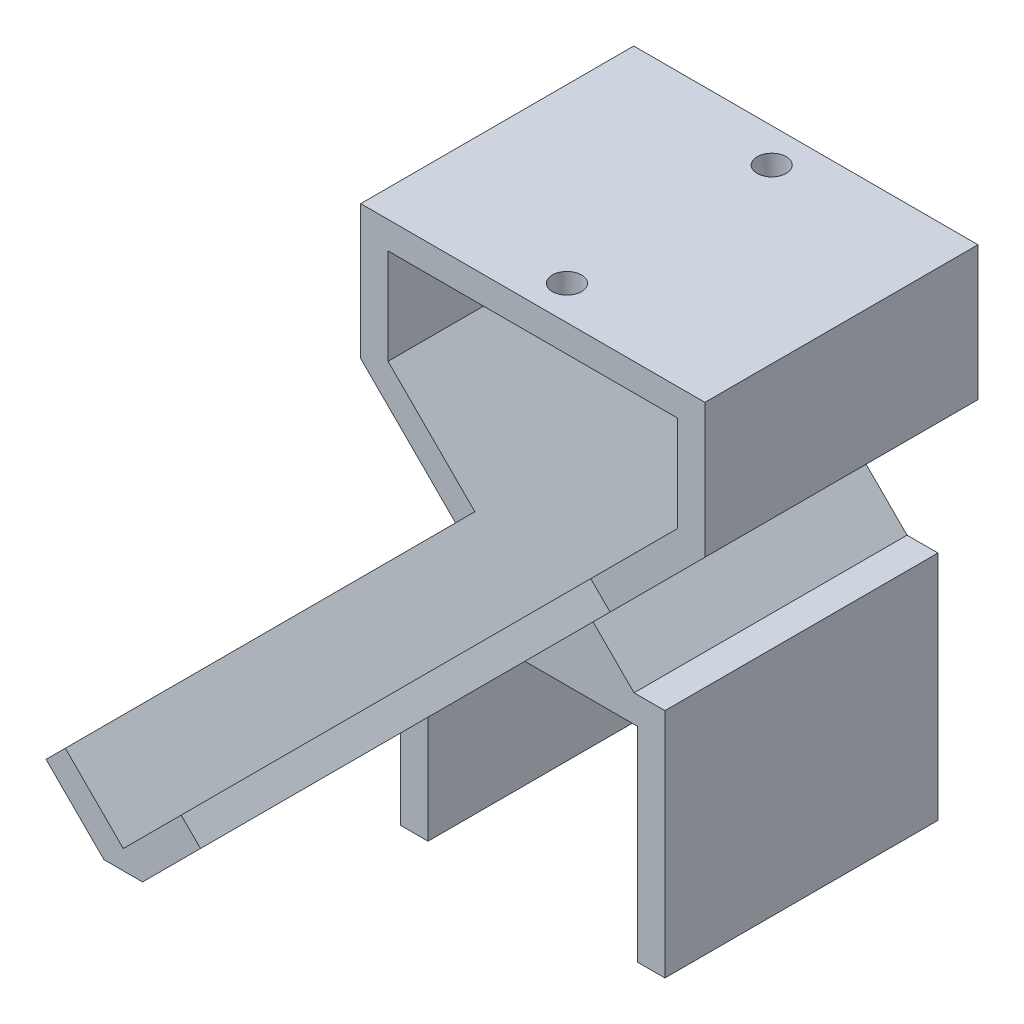
ISO-10303-21;
HEADER;
FILE_DESCRIPTION(('STEP AP214'),'2;1');
FILE_NAME('part.step','',(''),(''),'','','');
FILE_SCHEMA(('AUTOMOTIVE_DESIGN { 1 0 10303 214 1 1 1 1 }'));
ENDSEC;
DATA;
#1=APPLICATION_CONTEXT('core data for automotive mechanical design processes');
#2=APPLICATION_PROTOCOL_DEFINITION('international standard','automotive_design',2000,#1);
#3=PRODUCT_CONTEXT('',#1,'mechanical');
#4=PRODUCT('Part','Part','',(#3));
#5=PRODUCT_RELATED_PRODUCT_CATEGORY('part','',(#4));
#6=PRODUCT_DEFINITION_FORMATION('','',#4);
#7=PRODUCT_DEFINITION_CONTEXT('part definition',#1,'design');
#8=PRODUCT_DEFINITION('design','',#6,#7);
#9=PRODUCT_DEFINITION_SHAPE('','',#8);
#10=(LENGTH_UNIT() NAMED_UNIT(*) SI_UNIT(.MILLI.,.METRE.));
#11=(NAMED_UNIT(*) PLANE_ANGLE_UNIT() SI_UNIT($,.RADIAN.));
#12=(NAMED_UNIT(*) SI_UNIT($,.STERADIAN.) SOLID_ANGLE_UNIT());
#13=UNCERTAINTY_MEASURE_WITH_UNIT(LENGTH_MEASURE(1.E-05),#10,'distance_accuracy_value','');
#14=(GEOMETRIC_REPRESENTATION_CONTEXT(3) GLOBAL_UNCERTAINTY_ASSIGNED_CONTEXT((#13)) GLOBAL_UNIT_ASSIGNED_CONTEXT((#10,
#11,#12)) REPRESENTATION_CONTEXT('',''));
#15=CARTESIAN_POINT('',(0.,0.,0.));
#16=DIRECTION('',(0.,0.,1.));
#17=DIRECTION('',(1.,0.,0.));
#18=AXIS2_PLACEMENT_3D('',#15,#16,#17);
#19=CARTESIAN_POINT('',(1.79605122421383,-1.79605122421383,25.4));
#20=DIRECTION('',(0.,1.,0.));
#21=DIRECTION('',(0.,0.,-1.));
#22=AXIS2_PLACEMENT_3D('',#19,#20,#21);
#23=PLANE('',#22);
#24=DIRECTION('',(0.,0.,1.));
#25=VECTOR('',#24,1.);
#26=CARTESIAN_POINT('',(-1.79605122421384,-1.79605122421382,25.4));
#27=LINE('',#26,#25);
#28=CARTESIAN_POINT('',(-1.79605122421384,-1.79605122421382,25.4));
#29=VERTEX_POINT('',#28);
#30=CARTESIAN_POINT('',(-1.79605122421384,-1.79605122421382,63.5));
#31=VERTEX_POINT('',#30);
#32=EDGE_CURVE('E336',#29,#31,#27,.T.);
#33=ORIENTED_EDGE('',*,*,#32,.F.);
#34=DIRECTION('',(1.,0.,0.));
#35=VECTOR('',#34,1.);
#36=CARTESIAN_POINT('',(-1.79605122421384,-1.79605122421382,25.4));
#37=LINE('',#36,#35);
#38=CARTESIAN_POINT('',(1.79605122421383,-1.79605122421383,25.4));
#39=VERTEX_POINT('',#38);
#40=EDGE_CURVE('E226',#29,#39,#37,.T.);
#41=ORIENTED_EDGE('',*,*,#40,.T.);
#42=DIRECTION('',(0.,0.,-1.));
#43=VECTOR('',#42,1.);
#44=CARTESIAN_POINT('',(1.79605122421383,-1.79605122421383,25.4));
#45=LINE('',#44,#43);
#46=CARTESIAN_POINT('',(1.79605122421383,-1.79605122421383,63.5));
#47=VERTEX_POINT('',#46);
#48=EDGE_CURVE('E334',#47,#39,#45,.T.);
#49=ORIENTED_EDGE('',*,*,#48,.F.);
#50=DIRECTION('',(-1.,0.,0.));
#51=VECTOR('',#50,1.);
#52=CARTESIAN_POINT('',(0.,-1.79605122421383,63.5));
#53=LINE('',#52,#51);
#54=EDGE_CURVE('E339',#31,#47,#53,.F.);
#55=ORIENTED_EDGE('',*,*,#54,.F.);
#56=EDGE_LOOP('',(#33,#41,#49,#55));
#57=FACE_BOUND('',#56,.T.);
#58=ADVANCED_FACE('F35',(#57),#23,.F.);
#59=CARTESIAN_POINT('',(0.,0.,25.4));
#60=DIRECTION('',(0.,0.,-1.));
#61=DIRECTION('',(-1.,0.,0.));
#62=AXIS2_PLACEMENT_3D('',#59,#60,#61);
#63=PLANE('',#62);
#64=DIRECTION('',(-0.707106781186548,-0.707106781186548,0.));
#65=VECTOR('',#64,1.);
#66=CARTESIAN_POINT('',(-7.18420489685532,3.59210244842766,25.4));
#67=LINE('',#66,#65);
#68=CARTESIAN_POINT('',(-5.38815367264149,5.38815367264149,25.4));
#69=VERTEX_POINT('',#68);
#70=CARTESIAN_POINT('',(-7.18420489685532,3.59210244842766,25.4));
#71=VERTEX_POINT('',#70);
#72=EDGE_CURVE('E287',#69,#71,#67,.T.);
#73=ORIENTED_EDGE('',*,*,#72,.F.);
#74=DIRECTION('',(0.707106781186547,-0.707106781186547,0.));
#75=VECTOR('',#74,1.);
#76=CARTESIAN_POINT('',(0.,0.,25.4));
#77=LINE('',#76,#75);
#78=CARTESIAN_POINT('',(-13.4703841816037,13.4703841816037,25.4));
#79=VERTEX_POINT('',#78);
#80=EDGE_CURVE('E307',#79,#69,#77,.T.);
#81=ORIENTED_EDGE('',*,*,#80,.F.);
#82=DIRECTION('',(0.,-1.,0.));
#83=VECTOR('',#82,1.);
#84=CARTESIAN_POINT('',(-13.4703841816037,13.4703841816037,25.4));
#85=LINE('',#84,#83);
#86=CARTESIAN_POINT('',(-13.4703841816037,22.3603841816037,25.4));
#87=VERTEX_POINT('',#86);
#88=EDGE_CURVE('E560',#87,#79,#85,.T.);
#89=ORIENTED_EDGE('',*,*,#88,.F.);
#90=DIRECTION('',(-1.,0.,0.));
#91=VECTOR('',#90,1.);
#92=CARTESIAN_POINT('',(-13.4703841816037,22.3603841816037,25.4));
#93=LINE('',#92,#91);
#94=CARTESIAN_POINT('',(13.4703841816037,22.3603841816037,25.4));
#95=VERTEX_POINT('',#94);
#96=EDGE_CURVE('E563',#95,#87,#93,.T.);
#97=ORIENTED_EDGE('',*,*,#96,.F.);
#98=DIRECTION('',(0.,1.,0.));
#99=VECTOR('',#98,1.);
#100=CARTESIAN_POINT('',(13.4703841816037,22.3603841816037,25.4));
#101=LINE('',#100,#99);
#102=CARTESIAN_POINT('',(13.4703841816037,13.4703841816037,25.4));
#103=VERTEX_POINT('',#102);
#104=EDGE_CURVE('E566',#103,#95,#101,.T.);
#105=ORIENTED_EDGE('',*,*,#104,.F.);
#106=DIRECTION('',(0.707106781186547,0.707106781186547,0.));
#107=VECTOR('',#106,1.);
#108=CARTESIAN_POINT('',(13.4703841816037,13.4703841816037,25.4));
#109=LINE('',#108,#107);
#110=CARTESIAN_POINT('',(5.38815367264149,5.38815367264149,25.4));
#111=VERTEX_POINT('',#110);
#112=EDGE_CURVE('E543',#111,#103,#109,.T.);
#113=ORIENTED_EDGE('',*,*,#112,.F.);
#114=DIRECTION('',(-0.707106781186548,0.707106781186548,0.));
#115=VECTOR('',#114,1.);
#116=CARTESIAN_POINT('',(7.18420489685532,3.59210244842766,25.4));
#117=LINE('',#116,#115);
#118=CARTESIAN_POINT('',(7.18420489685532,3.59210244842766,25.4));
#119=VERTEX_POINT('',#118);
#120=EDGE_CURVE('E282',#119,#111,#117,.T.);
#121=ORIENTED_EDGE('',*,*,#120,.F.);
#122=DIRECTION('',(0.707106781186547,0.707106781186548,0.));
#123=VECTOR('',#122,1.);
#124=CARTESIAN_POINT('',(16.0103841816037,12.4182817331761,25.4));
#125=LINE('',#124,#123);
#126=CARTESIAN_POINT('',(16.0103841816037,12.4182817331761,25.4));
#127=VERTEX_POINT('',#126);
#128=EDGE_CURVE('E344',#119,#127,#125,.T.);
#129=ORIENTED_EDGE('',*,*,#128,.T.);
#130=DIRECTION('',(0.,1.,0.));
#131=VECTOR('',#130,1.);
#132=CARTESIAN_POINT('',(16.0103841816037,24.9003841816037,25.4));
#133=LINE('',#132,#131);
#134=CARTESIAN_POINT('',(16.0103841816037,24.9003841816037,25.4));
#135=VERTEX_POINT('',#134);
#136=EDGE_CURVE('E396',#127,#135,#133,.T.);
#137=ORIENTED_EDGE('',*,*,#136,.T.);
#138=DIRECTION('',(-1.,0.,0.));
#139=VECTOR('',#138,1.);
#140=CARTESIAN_POINT('',(-16.0103841816037,24.9003841816037,25.4));
#141=LINE('',#140,#139);
#142=CARTESIAN_POINT('',(-16.0103841816037,24.9003841816037,25.4));
#143=VERTEX_POINT('',#142);
#144=EDGE_CURVE('E404',#135,#143,#141,.T.);
#145=ORIENTED_EDGE('',*,*,#144,.T.);
#146=DIRECTION('',(0.,-1.,0.));
#147=VECTOR('',#146,1.);
#148=CARTESIAN_POINT('',(-16.0103841816037,12.4182817331761,25.4));
#149=LINE('',#148,#147);
#150=CARTESIAN_POINT('',(-16.0103841816037,12.4182817331761,25.4));
#151=VERTEX_POINT('',#150);
#152=EDGE_CURVE('E406',#143,#151,#149,.T.);
#153=ORIENTED_EDGE('',*,*,#152,.T.);
#154=DIRECTION('',(0.707106781186548,-0.707106781186547,0.));
#155=VECTOR('',#154,1.);
#156=CARTESIAN_POINT('',(0.,-3.59210244842766,25.4));
#157=LINE('',#156,#155);
#158=EDGE_CURVE('E397',#151,#71,#157,.T.);
#159=ORIENTED_EDGE('',*,*,#158,.T.);
#160=EDGE_LOOP('',(#73,#81,#89,#97,#105,#113,#121,#129,#137,#145,#153,#159));
#161=FACE_BOUND('',#160,.T.);
#162=ADVANCED_FACE('F441',(#161),#63,.F.);
#163=CARTESIAN_POINT('',(0.,0.,0.));
#164=DIRECTION('',(0.,0.,-1.));
#165=DIRECTION('',(-1.,0.,0.));
#166=AXIS2_PLACEMENT_3D('',#163,#164,#165);
#167=PLANE('',#166);
#168=DIRECTION('',(0.707106781186547,0.707106781186548,0.));
#169=VECTOR('',#168,1.);
#170=CARTESIAN_POINT('',(16.0103841816037,12.4182817331761,0.));
#171=LINE('',#170,#169);
#172=CARTESIAN_POINT('',(5.60605122421381,2.01394877578615,0.));
#173=VERTEX_POINT('',#172);
#174=CARTESIAN_POINT('',(16.0103841816037,12.4182817331761,0.));
#175=VERTEX_POINT('',#174);
#176=EDGE_CURVE('E350',#173,#175,#171,.T.);
#177=ORIENTED_EDGE('',*,*,#176,.F.);
#178=DIRECTION('',(0.707106781186552,-0.707106781186543,0.));
#179=VECTOR('',#178,1.);
#180=CARTESIAN_POINT('',(5.60605122421381,2.01394877578615,0.));
#181=LINE('',#180,#179);
#182=CARTESIAN_POINT('',(9.41605122421384,-1.79605122421383,0.));
#183=VERTEX_POINT('',#182);
#184=EDGE_CURVE('E367',#173,#183,#181,.T.);
#185=ORIENTED_EDGE('',*,*,#184,.T.);
#186=DIRECTION('',(1.,0.,0.));
#187=VECTOR('',#186,1.);
#188=CARTESIAN_POINT('',(1.79605122421383,-1.79605122421383,0.));
#189=LINE('',#188,#187);
#190=CARTESIAN_POINT('',(12.29,-1.79605122421383,0.));
#191=VERTEX_POINT('',#190);
#192=EDGE_CURVE('E263',#183,#191,#189,.T.);
#193=ORIENTED_EDGE('',*,*,#192,.T.);
#194=DIRECTION('',(0.,-1.,0.));
#195=VECTOR('',#194,1.);
#196=CARTESIAN_POINT('',(12.29,-1.79605122421383,0.));
#197=LINE('',#196,#195);
#198=CARTESIAN_POINT('',(12.29,-23.3360512242138,0.));
#199=VERTEX_POINT('',#198);
#200=EDGE_CURVE('E232',#191,#199,#197,.T.);
#201=ORIENTED_EDGE('',*,*,#200,.T.);
#202=DIRECTION('',(-1.,0.,0.));
#203=VECTOR('',#202,1.);
#204=CARTESIAN_POINT('',(12.29,-23.3360512242138,0.));
#205=LINE('',#204,#203);
#206=CARTESIAN_POINT('',(9.75,-23.3360512242138,0.));
#207=VERTEX_POINT('',#206);
#208=EDGE_CURVE('E830',#199,#207,#205,.T.);
#209=ORIENTED_EDGE('',*,*,#208,.T.);
#210=DIRECTION('',(0.,1.,0.));
#211=VECTOR('',#210,1.);
#212=CARTESIAN_POINT('',(9.75,-23.3360512242138,0.));
#213=LINE('',#212,#211);
#214=CARTESIAN_POINT('',(9.75,-4.33605122421383,0.));
#215=VERTEX_POINT('',#214);
#216=EDGE_CURVE('E833',#207,#215,#213,.T.);
#217=ORIENTED_EDGE('',*,*,#216,.T.);
#218=DIRECTION('',(-1.,0.,0.));
#219=VECTOR('',#218,1.);
#220=CARTESIAN_POINT('',(9.75,-4.33605122421383,0.));
#221=LINE('',#220,#219);
#222=CARTESIAN_POINT('',(-9.75,-4.33605122421383,0.));
#223=VERTEX_POINT('',#222);
#224=EDGE_CURVE('E834',#215,#223,#221,.T.);
#225=ORIENTED_EDGE('',*,*,#224,.T.);
#226=DIRECTION('',(0.,-1.,0.));
#227=VECTOR('',#226,1.);
#228=CARTESIAN_POINT('',(-9.75000000000001,-23.3360512242138,0.));
#229=LINE('',#228,#227);
#230=CARTESIAN_POINT('',(-9.75000000000001,-23.3360512242138,0.));
#231=VERTEX_POINT('',#230);
#232=EDGE_CURVE('E819',#223,#231,#229,.T.);
#233=ORIENTED_EDGE('',*,*,#232,.T.);
#234=DIRECTION('',(-1.,0.,0.));
#235=VECTOR('',#234,1.);
#236=CARTESIAN_POINT('',(-12.29,-23.3360512242138,0.));
#237=LINE('',#236,#235);
#238=CARTESIAN_POINT('',(-12.29,-23.3360512242138,0.));
#239=VERTEX_POINT('',#238);
#240=EDGE_CURVE('E839',#231,#239,#237,.T.);
#241=ORIENTED_EDGE('',*,*,#240,.T.);
#242=DIRECTION('',(0.,1.,0.));
#243=VECTOR('',#242,1.);
#244=CARTESIAN_POINT('',(-12.29,-1.79605122421383,0.));
#245=LINE('',#244,#243);
#246=CARTESIAN_POINT('',(-12.29,-1.79605122421383,0.));
#247=VERTEX_POINT('',#246);
#248=EDGE_CURVE('E224',#239,#247,#245,.T.);
#249=ORIENTED_EDGE('',*,*,#248,.T.);
#250=CARTESIAN_POINT('',(-9.41605122421382,-1.79605122421383,0.));
#251=VERTEX_POINT('',#250);
#252=EDGE_CURVE('E267',#247,#251,#189,.T.);
#253=ORIENTED_EDGE('',*,*,#252,.T.);
#254=DIRECTION('',(0.707106781186551,0.707106781186544,0.));
#255=VECTOR('',#254,1.);
#256=CARTESIAN_POINT('',(-5.60605122421381,2.01394877578615,0.));
#257=LINE('',#256,#255);
#258=CARTESIAN_POINT('',(-5.60605122421381,2.01394877578615,0.));
#259=VERTEX_POINT('',#258);
#260=EDGE_CURVE('E11',#251,#259,#257,.T.);
#261=ORIENTED_EDGE('',*,*,#260,.T.);
#262=DIRECTION('',(0.707106781186548,-0.707106781186547,0.));
#263=VECTOR('',#262,1.);
#264=CARTESIAN_POINT('',(0.,-3.59210244842766,0.));
#265=LINE('',#264,#263);
#266=CARTESIAN_POINT('',(-16.0103841816037,12.4182817331761,0.));
#267=VERTEX_POINT('',#266);
#268=EDGE_CURVE('E341',#267,#259,#265,.T.);
#269=ORIENTED_EDGE('',*,*,#268,.F.);
#270=DIRECTION('',(0.,-1.,0.));
#271=VECTOR('',#270,1.);
#272=CARTESIAN_POINT('',(-16.0103841816037,12.4182817331761,0.));
#273=LINE('',#272,#271);
#274=CARTESIAN_POINT('',(-16.0103841816037,24.9003841816037,0.));
#275=VERTEX_POINT('',#274);
#276=EDGE_CURVE('E345',#275,#267,#273,.T.);
#277=ORIENTED_EDGE('',*,*,#276,.F.);
#278=DIRECTION('',(-1.,0.,0.));
#279=VECTOR('',#278,1.);
#280=CARTESIAN_POINT('',(-16.0103841816037,24.9003841816037,0.));
#281=LINE('',#280,#279);
#282=CARTESIAN_POINT('',(16.0103841816037,24.9003841816037,0.));
#283=VERTEX_POINT('',#282);
#284=EDGE_CURVE('E410',#283,#275,#281,.T.);
#285=ORIENTED_EDGE('',*,*,#284,.F.);
#286=DIRECTION('',(0.,1.,0.));
#287=VECTOR('',#286,1.);
#288=CARTESIAN_POINT('',(16.0103841816037,24.9003841816037,0.));
#289=LINE('',#288,#287);
#290=EDGE_CURVE('E352',#175,#283,#289,.T.);
#291=ORIENTED_EDGE('',*,*,#290,.F.);
#292=EDGE_LOOP('',(#177,#185,#193,#201,#209,#217,#225,#233,#241,#249,#253,#261,#269,#277,#285,#291));
#293=FACE_BOUND('',#292,.T.);
#294=DIRECTION('',(0.707106781186547,-0.707106781186547,0.));
#295=VECTOR('',#294,1.);
#296=CARTESIAN_POINT('',(0.,0.,0.));
#297=LINE('',#296,#295);
#298=CARTESIAN_POINT('',(-13.4703841816037,13.4703841816037,0.));
#299=VERTEX_POINT('',#298);
#300=CARTESIAN_POINT('',(0.,0.,0.));
#301=VERTEX_POINT('',#300);
#302=EDGE_CURVE('E582',#299,#301,#297,.T.);
#303=ORIENTED_EDGE('',*,*,#302,.T.);
#304=DIRECTION('',(0.707106781186547,0.707106781186547,0.));
#305=VECTOR('',#304,1.);
#306=CARTESIAN_POINT('',(13.4703841816037,13.4703841816037,0.));
#307=LINE('',#306,#305);
#308=CARTESIAN_POINT('',(13.4703841816037,13.4703841816037,0.));
#309=VERTEX_POINT('',#308);
#310=EDGE_CURVE('E319',#301,#309,#307,.T.);
#311=ORIENTED_EDGE('',*,*,#310,.T.);
#312=DIRECTION('',(0.,1.,0.));
#313=VECTOR('',#312,1.);
#314=CARTESIAN_POINT('',(13.4703841816037,22.3603841816037,0.));
#315=LINE('',#314,#313);
#316=CARTESIAN_POINT('',(13.4703841816037,22.3603841816037,0.));
#317=VERTEX_POINT('',#316);
#318=EDGE_CURVE('E573',#309,#317,#315,.T.);
#319=ORIENTED_EDGE('',*,*,#318,.T.);
#320=DIRECTION('',(-1.,0.,0.));
#321=VECTOR('',#320,1.);
#322=CARTESIAN_POINT('',(-13.4703841816037,22.3603841816037,0.));
#323=LINE('',#322,#321);
#324=CARTESIAN_POINT('',(-13.4703841816037,22.3603841816037,0.));
#325=VERTEX_POINT('',#324);
#326=EDGE_CURVE('E576',#317,#325,#323,.T.);
#327=ORIENTED_EDGE('',*,*,#326,.T.);
#328=DIRECTION('',(0.,-1.,0.));
#329=VECTOR('',#328,1.);
#330=CARTESIAN_POINT('',(-13.4703841816037,13.4703841816037,0.));
#331=LINE('',#330,#329);
#332=EDGE_CURVE('E579',#325,#299,#331,.T.);
#333=ORIENTED_EDGE('',*,*,#332,.T.);
#334=EDGE_LOOP('',(#303,#311,#319,#327,#333));
#335=FACE_BOUND('',#334,.T.);
#336=ADVANCED_FACE('F377',(#293,#335),#167,.T.);
#337=CARTESIAN_POINT('',(16.0103841816037,12.4182817331761,25.4));
#338=DIRECTION('',(-0.707106781186548,0.707106781186547,0.));
#339=DIRECTION('',(-0.707106781186547,-0.707106781186548,0.));
#340=AXIS2_PLACEMENT_3D('',#337,#338,#339);
#341=PLANE('',#340);
#342=DIRECTION('',(0.707106781186547,0.707106781186548,0.));
#343=VECTOR('',#342,1.);
#344=CARTESIAN_POINT('',(16.0103841816037,12.4182817331761,25.4));
#345=LINE('',#344,#343);
#346=CARTESIAN_POINT('',(5.60605122421381,2.01394877578615,25.4));
#347=VERTEX_POINT('',#346);
#348=EDGE_CURVE('E50',#39,#347,#345,.T.);
#349=ORIENTED_EDGE('',*,*,#348,.T.);
#350=DIRECTION('',(0.,0.,-1.));
#351=VECTOR('',#350,1.);
#352=CARTESIAN_POINT('',(5.60605122421381,2.01394877578615,25.4));
#353=LINE('',#352,#351);
#354=EDGE_CURVE('E354',#347,#173,#353,.T.);
#355=ORIENTED_EDGE('',*,*,#354,.T.);
#356=ORIENTED_EDGE('',*,*,#176,.T.);
#357=DIRECTION('',(0.,0.,-1.));
#358=VECTOR('',#357,1.);
#359=CARTESIAN_POINT('',(16.0103841816037,12.4182817331761,25.4));
#360=LINE('',#359,#358);
#361=EDGE_CURVE('E337',#127,#175,#360,.T.);
#362=ORIENTED_EDGE('',*,*,#361,.F.);
#363=ORIENTED_EDGE('',*,*,#128,.F.);
#364=DIRECTION('',(0.,0.,-1.));
#365=VECTOR('',#364,1.);
#366=CARTESIAN_POINT('',(7.18420489685532,3.59210244842766,63.5));
#367=LINE('',#366,#365);
#368=CARTESIAN_POINT('',(7.18420489685532,3.59210244842766,63.5));
#369=VERTEX_POINT('',#368);
#370=EDGE_CURVE('E313',#369,#119,#367,.T.);
#371=ORIENTED_EDGE('',*,*,#370,.F.);
#372=DIRECTION('',(0.707106781186547,0.707106781186548,0.));
#373=VECTOR('',#372,1.);
#374=CARTESIAN_POINT('',(0.,-3.59210244842766,63.5));
#375=LINE('',#374,#373);
#376=EDGE_CURVE('E286',#47,#369,#375,.T.);
#377=ORIENTED_EDGE('',*,*,#376,.F.);
#378=ORIENTED_EDGE('',*,*,#48,.T.);
#379=EDGE_LOOP('',(#349,#355,#356,#362,#363,#371,#377,#378));
#380=FACE_BOUND('',#379,.T.);
#381=ADVANCED_FACE('F371',(#380),#341,.F.);
#382=CARTESIAN_POINT('',(16.0103841816037,24.9003841816037,25.4));
#383=DIRECTION('',(-1.,0.,0.));
#384=DIRECTION('',(0.,-1.,0.));
#385=AXIS2_PLACEMENT_3D('',#382,#383,#384);
#386=PLANE('',#385);
#387=ORIENTED_EDGE('',*,*,#290,.T.);
#388=DIRECTION('',(0.,0.,-1.));
#389=VECTOR('',#388,1.);
#390=CARTESIAN_POINT('',(16.0103841816037,24.9003841816037,25.4));
#391=LINE('',#390,#389);
#392=EDGE_CURVE('E387',#135,#283,#391,.T.);
#393=ORIENTED_EDGE('',*,*,#392,.F.);
#394=ORIENTED_EDGE('',*,*,#136,.F.);
#395=ORIENTED_EDGE('',*,*,#361,.T.);
#396=EDGE_LOOP('',(#387,#393,#394,#395));
#397=FACE_BOUND('',#396,.T.);
#398=ADVANCED_FACE('F535',(#397),#386,.F.);
#399=CARTESIAN_POINT('',(-16.0103841816037,24.9003841816037,25.4));
#400=DIRECTION('',(0.,-1.,0.));
#401=DIRECTION('',(0.,0.,-1.));
#402=AXIS2_PLACEMENT_3D('',#399,#400,#401);
#403=PLANE('',#402);
#404=CARTESIAN_POINT('',(0.,24.9003841816037,3.175));
#405=DIRECTION('',(0.,1.,0.));
#406=DIRECTION('',(0.,0.,1.));
#407=AXIS2_PLACEMENT_3D('',#404,#405,#406);
#408=CIRCLE('',#407,1.35254999999999);
#409=CARTESIAN_POINT('',(0.,24.9003841816037,4.52754999999999));
#410=VERTEX_POINT('',#409);
#411=EDGE_CURVE('E271',#410,#410,#408,.T.);
#412=ORIENTED_EDGE('',*,*,#411,.F.);
#413=EDGE_LOOP('',(#412));
#414=FACE_BOUND('',#413,.T.);
#415=CARTESIAN_POINT('',(0.,24.9003841816037,22.225));
#416=DIRECTION('',(0.,1.,0.));
#417=DIRECTION('',(0.,0.,1.));
#418=AXIS2_PLACEMENT_3D('',#415,#416,#417);
#419=CIRCLE('',#418,1.35254999999999);
#420=CARTESIAN_POINT('',(0.,24.9003841816037,23.57755));
#421=VERTEX_POINT('',#420);
#422=EDGE_CURVE('E276',#421,#421,#419,.T.);
#423=ORIENTED_EDGE('',*,*,#422,.F.);
#424=EDGE_LOOP('',(#423));
#425=FACE_BOUND('',#424,.T.);
#426=ORIENTED_EDGE('',*,*,#284,.T.);
#427=DIRECTION('',(0.,0.,-1.));
#428=VECTOR('',#427,1.);
#429=CARTESIAN_POINT('',(-16.0103841816037,24.9003841816037,25.4));
#430=LINE('',#429,#428);
#431=EDGE_CURVE('E390',#143,#275,#430,.T.);
#432=ORIENTED_EDGE('',*,*,#431,.F.);
#433=ORIENTED_EDGE('',*,*,#144,.F.);
#434=ORIENTED_EDGE('',*,*,#392,.T.);
#435=EDGE_LOOP('',(#426,#432,#433,#434));
#436=FACE_BOUND('',#435,.T.);
#437=ADVANCED_FACE('F533',(#414,#425,#436),#403,.F.);
#438=CARTESIAN_POINT('',(-16.0103841816037,12.4182817331761,25.4));
#439=DIRECTION('',(1.,0.,0.));
#440=DIRECTION('',(0.,1.,0.));
#441=AXIS2_PLACEMENT_3D('',#438,#439,#440);
#442=PLANE('',#441);
#443=ORIENTED_EDGE('',*,*,#276,.T.);
#444=DIRECTION('',(0.,0.,-1.));
#445=VECTOR('',#444,1.);
#446=CARTESIAN_POINT('',(-16.0103841816037,12.4182817331761,25.4));
#447=LINE('',#446,#445);
#448=EDGE_CURVE('E413',#151,#267,#447,.T.);
#449=ORIENTED_EDGE('',*,*,#448,.F.);
#450=ORIENTED_EDGE('',*,*,#152,.F.);
#451=ORIENTED_EDGE('',*,*,#431,.T.);
#452=EDGE_LOOP('',(#443,#449,#450,#451));
#453=FACE_BOUND('',#452,.T.);
#454=ADVANCED_FACE('F420',(#453),#442,.F.);
#455=CARTESIAN_POINT('',(0.,-3.59210244842766,25.4));
#456=DIRECTION('',(0.707106781186547,0.707106781186548,0.));
#457=DIRECTION('',(-0.707106781186548,0.707106781186547,0.));
#458=AXIS2_PLACEMENT_3D('',#455,#456,#457);
#459=PLANE('',#458);
#460=ORIENTED_EDGE('',*,*,#268,.T.);
#461=DIRECTION('',(0.,0.,1.));
#462=VECTOR('',#461,1.);
#463=CARTESIAN_POINT('',(-5.60605122421381,2.01394877578615,25.4));
#464=LINE('',#463,#462);
#465=CARTESIAN_POINT('',(-5.60605122421381,2.01394877578615,25.4));
#466=VERTEX_POINT('',#465);
#467=EDGE_CURVE('E360',#259,#466,#464,.T.);
#468=ORIENTED_EDGE('',*,*,#467,.T.);
#469=DIRECTION('',(0.707106781186548,-0.707106781186547,0.));
#470=VECTOR('',#469,1.);
#471=CARTESIAN_POINT('',(0.,-3.59210244842766,25.4));
#472=LINE('',#471,#470);
#473=EDGE_CURVE('E359',#466,#29,#472,.T.);
#474=ORIENTED_EDGE('',*,*,#473,.T.);
#475=ORIENTED_EDGE('',*,*,#32,.T.);
#476=DIRECTION('',(0.707106781186548,-0.707106781186547,0.));
#477=VECTOR('',#476,1.);
#478=CARTESIAN_POINT('',(-7.18420489685532,3.59210244842766,63.5));
#479=LINE('',#478,#477);
#480=CARTESIAN_POINT('',(-7.18420489685532,3.59210244842766,63.5));
#481=VERTEX_POINT('',#480);
#482=EDGE_CURVE('E283',#481,#31,#479,.T.);
#483=ORIENTED_EDGE('',*,*,#482,.F.);
#484=DIRECTION('',(0.,0.,-1.));
#485=VECTOR('',#484,1.);
#486=CARTESIAN_POINT('',(-7.18420489685532,3.59210244842766,63.5));
#487=LINE('',#486,#485);
#488=EDGE_CURVE('E298',#481,#71,#487,.T.);
#489=ORIENTED_EDGE('',*,*,#488,.T.);
#490=ORIENTED_EDGE('',*,*,#158,.F.);
#491=ORIENTED_EDGE('',*,*,#448,.T.);
#492=EDGE_LOOP('',(#460,#468,#474,#475,#483,#489,#490,#491));
#493=FACE_BOUND('',#492,.T.);
#494=ADVANCED_FACE('F428',(#493),#459,.F.);
#495=CARTESIAN_POINT('',(13.4703841816037,13.4703841816037,25.4));
#496=DIRECTION('',(-0.707106781186548,0.707106781186548,0.));
#497=DIRECTION('',(-0.707106781186548,-0.707106781186548,0.));
#498=AXIS2_PLACEMENT_3D('',#495,#496,#497);
#499=PLANE('',#498);
#500=ORIENTED_EDGE('',*,*,#310,.F.);
#501=DIRECTION('',(0.,0.,-1.));
#502=VECTOR('',#501,1.);
#503=CARTESIAN_POINT('',(0.,0.,25.4));
#504=LINE('',#503,#502);
#505=CARTESIAN_POINT('',(0.,0.,63.5));
#506=VERTEX_POINT('',#505);
#507=EDGE_CURVE('E550',#506,#301,#504,.T.);
#508=ORIENTED_EDGE('',*,*,#507,.F.);
#509=DIRECTION('',(-0.707106781186547,-0.707106781186548,0.));
#510=VECTOR('',#509,1.);
#511=CARTESIAN_POINT('',(0.,0.,63.5));
#512=LINE('',#511,#510);
#513=CARTESIAN_POINT('',(5.38815367264149,5.38815367264149,63.5));
#514=VERTEX_POINT('',#513);
#515=EDGE_CURVE('E291',#514,#506,#512,.T.);
#516=ORIENTED_EDGE('',*,*,#515,.F.);
#517=DIRECTION('',(0.,0.,-1.));
#518=VECTOR('',#517,1.);
#519=CARTESIAN_POINT('',(5.38815367264149,5.38815367264149,63.5));
#520=LINE('',#519,#518);
#521=EDGE_CURVE('E310',#514,#111,#520,.T.);
#522=ORIENTED_EDGE('',*,*,#521,.T.);
#523=ORIENTED_EDGE('',*,*,#112,.T.);
#524=DIRECTION('',(0.,0.,-1.));
#525=VECTOR('',#524,1.);
#526=CARTESIAN_POINT('',(13.4703841816037,13.4703841816037,25.4));
#527=LINE('',#526,#525);
#528=EDGE_CURVE('E353',#103,#309,#527,.T.);
#529=ORIENTED_EDGE('',*,*,#528,.T.);
#530=EDGE_LOOP('',(#500,#508,#516,#522,#523,#529));
#531=FACE_BOUND('',#530,.T.);
#532=ADVANCED_FACE('F522',(#531),#499,.T.);
#533=CARTESIAN_POINT('',(13.4703841816037,22.3603841816037,25.4));
#534=DIRECTION('',(-1.,0.,0.));
#535=DIRECTION('',(0.,-1.,0.));
#536=AXIS2_PLACEMENT_3D('',#533,#534,#535);
#537=PLANE('',#536);
#538=ORIENTED_EDGE('',*,*,#318,.F.);
#539=ORIENTED_EDGE('',*,*,#528,.F.);
#540=ORIENTED_EDGE('',*,*,#104,.T.);
#541=DIRECTION('',(0.,0.,-1.));
#542=VECTOR('',#541,1.);
#543=CARTESIAN_POINT('',(13.4703841816037,22.3603841816037,25.4));
#544=LINE('',#543,#542);
#545=EDGE_CURVE('E586',#95,#317,#544,.T.);
#546=ORIENTED_EDGE('',*,*,#545,.T.);
#547=EDGE_LOOP('',(#538,#539,#540,#546));
#548=FACE_BOUND('',#547,.T.);
#549=ADVANCED_FACE('F518',(#548),#537,.T.);
#550=CARTESIAN_POINT('',(-13.4703841816037,22.3603841816037,25.4));
#551=DIRECTION('',(0.,-1.,0.));
#552=DIRECTION('',(0.,0.,-1.));
#553=AXIS2_PLACEMENT_3D('',#550,#551,#552);
#554=PLANE('',#553);
#555=CARTESIAN_POINT('',(0.,22.3603841816037,3.175));
#556=DIRECTION('',(0.,-1.,0.));
#557=DIRECTION('',(0.,0.,-1.));
#558=AXIS2_PLACEMENT_3D('',#555,#556,#557);
#559=CIRCLE('',#558,1.35254999999999);
#560=CARTESIAN_POINT('',(0.,22.3603841816037,1.82245000000001));
#561=VERTEX_POINT('',#560);
#562=EDGE_CURVE('E274',#561,#561,#559,.T.);
#563=ORIENTED_EDGE('',*,*,#562,.F.);
#564=EDGE_LOOP('',(#563));
#565=FACE_BOUND('',#564,.T.);
#566=CARTESIAN_POINT('',(0.,22.3603841816037,22.225));
#567=DIRECTION('',(0.,-1.,0.));
#568=DIRECTION('',(0.,0.,-1.));
#569=AXIS2_PLACEMENT_3D('',#566,#567,#568);
#570=CIRCLE('',#569,1.35254999999999);
#571=CARTESIAN_POINT('',(0.,22.3603841816037,20.87245));
#572=VERTEX_POINT('',#571);
#573=EDGE_CURVE('E279',#572,#572,#570,.T.);
#574=ORIENTED_EDGE('',*,*,#573,.F.);
#575=EDGE_LOOP('',(#574));
#576=FACE_BOUND('',#575,.T.);
#577=ORIENTED_EDGE('',*,*,#326,.F.);
#578=ORIENTED_EDGE('',*,*,#545,.F.);
#579=ORIENTED_EDGE('',*,*,#96,.T.);
#580=DIRECTION('',(0.,0.,-1.));
#581=VECTOR('',#580,1.);
#582=CARTESIAN_POINT('',(-13.4703841816037,22.3603841816037,25.4));
#583=LINE('',#582,#581);
#584=EDGE_CURVE('E585',#87,#325,#583,.T.);
#585=ORIENTED_EDGE('',*,*,#584,.T.);
#586=EDGE_LOOP('',(#577,#578,#579,#585));
#587=FACE_BOUND('',#586,.T.);
#588=ADVANCED_FACE('F514',(#565,#576,#587),#554,.T.);
#589=CARTESIAN_POINT('',(-13.4703841816037,13.4703841816037,25.4));
#590=DIRECTION('',(1.,0.,0.));
#591=DIRECTION('',(0.,1.,0.));
#592=AXIS2_PLACEMENT_3D('',#589,#590,#591);
#593=PLANE('',#592);
#594=ORIENTED_EDGE('',*,*,#332,.F.);
#595=ORIENTED_EDGE('',*,*,#584,.F.);
#596=ORIENTED_EDGE('',*,*,#88,.T.);
#597=DIRECTION('',(0.,0.,-1.));
#598=VECTOR('',#597,1.);
#599=CARTESIAN_POINT('',(-13.4703841816037,13.4703841816037,25.4));
#600=LINE('',#599,#598);
#601=EDGE_CURVE('E561',#79,#299,#600,.T.);
#602=ORIENTED_EDGE('',*,*,#601,.T.);
#603=EDGE_LOOP('',(#594,#595,#596,#602));
#604=FACE_BOUND('',#603,.T.);
#605=ADVANCED_FACE('F510',(#604),#593,.T.);
#606=CARTESIAN_POINT('',(0.,0.,25.4));
#607=DIRECTION('',(0.707106781186548,0.707106781186548,0.));
#608=DIRECTION('',(-0.707106781186548,0.707106781186548,0.));
#609=AXIS2_PLACEMENT_3D('',#606,#607,#608);
#610=PLANE('',#609);
#611=ORIENTED_EDGE('',*,*,#302,.F.);
#612=ORIENTED_EDGE('',*,*,#601,.F.);
#613=ORIENTED_EDGE('',*,*,#80,.T.);
#614=DIRECTION('',(0.,0.,-1.));
#615=VECTOR('',#614,1.);
#616=CARTESIAN_POINT('',(-5.38815367264149,5.38815367264149,63.5));
#617=LINE('',#616,#615);
#618=CARTESIAN_POINT('',(-5.38815367264149,5.38815367264149,63.5));
#619=VERTEX_POINT('',#618);
#620=EDGE_CURVE('E314',#619,#69,#617,.T.);
#621=ORIENTED_EDGE('',*,*,#620,.F.);
#622=DIRECTION('',(-0.707106781186548,0.707106781186548,0.));
#623=VECTOR('',#622,1.);
#624=CARTESIAN_POINT('',(0.,0.,63.5));
#625=LINE('',#624,#623);
#626=EDGE_CURVE('E294',#506,#619,#625,.T.);
#627=ORIENTED_EDGE('',*,*,#626,.F.);
#628=ORIENTED_EDGE('',*,*,#507,.T.);
#629=EDGE_LOOP('',(#611,#612,#613,#621,#627,#628));
#630=FACE_BOUND('',#629,.T.);
#631=ADVANCED_FACE('F506',(#630),#610,.T.);
#632=CARTESIAN_POINT('',(7.18420489685532,3.59210244842766,63.5));
#633=DIRECTION('',(-0.707106781186548,-0.707106781186548,0.));
#634=DIRECTION('',(0.707106781186548,-0.707106781186548,0.));
#635=AXIS2_PLACEMENT_3D('',#632,#633,#634);
#636=PLANE('',#635);
#637=ORIENTED_EDGE('',*,*,#120,.T.);
#638=ORIENTED_EDGE('',*,*,#521,.F.);
#639=DIRECTION('',(-0.707106781186548,0.707106781186548,0.));
#640=VECTOR('',#639,1.);
#641=CARTESIAN_POINT('',(7.18420489685532,3.59210244842766,63.5));
#642=LINE('',#641,#640);
#643=EDGE_CURVE('E289',#369,#514,#642,.T.);
#644=ORIENTED_EDGE('',*,*,#643,.F.);
#645=ORIENTED_EDGE('',*,*,#370,.T.);
#646=EDGE_LOOP('',(#637,#638,#644,#645));
#647=FACE_BOUND('',#646,.T.);
#648=ADVANCED_FACE('F502',(#647),#636,.F.);
#649=CARTESIAN_POINT('',(-7.18420489685532,3.59210244842766,63.5));
#650=DIRECTION('',(0.707106781186548,-0.707106781186548,0.));
#651=DIRECTION('',(0.707106781186548,0.707106781186548,0.));
#652=AXIS2_PLACEMENT_3D('',#649,#650,#651);
#653=PLANE('',#652);
#654=ORIENTED_EDGE('',*,*,#72,.T.);
#655=ORIENTED_EDGE('',*,*,#488,.F.);
#656=DIRECTION('',(-0.707106781186548,-0.707106781186548,0.));
#657=VECTOR('',#656,1.);
#658=CARTESIAN_POINT('',(-7.18420489685532,3.59210244842766,63.5));
#659=LINE('',#658,#657);
#660=EDGE_CURVE('E296',#619,#481,#659,.T.);
#661=ORIENTED_EDGE('',*,*,#660,.F.);
#662=ORIENTED_EDGE('',*,*,#620,.T.);
#663=EDGE_LOOP('',(#654,#655,#661,#662));
#664=FACE_BOUND('',#663,.T.);
#665=ADVANCED_FACE('F499',(#664),#653,.F.);
#666=CARTESIAN_POINT('',(0.,0.,63.5));
#667=DIRECTION('',(0.,0.,1.));
#668=DIRECTION('',(1.,0.,0.));
#669=AXIS2_PLACEMENT_3D('',#666,#667,#668);
#670=PLANE('',#669);
#671=ORIENTED_EDGE('',*,*,#482,.T.);
#672=ORIENTED_EDGE('',*,*,#54,.T.);
#673=ORIENTED_EDGE('',*,*,#376,.T.);
#674=ORIENTED_EDGE('',*,*,#643,.T.);
#675=ORIENTED_EDGE('',*,*,#515,.T.);
#676=ORIENTED_EDGE('',*,*,#626,.T.);
#677=ORIENTED_EDGE('',*,*,#660,.T.);
#678=EDGE_LOOP('',(#671,#672,#673,#674,#675,#676,#677));
#679=FACE_BOUND('',#678,.T.);
#680=ADVANCED_FACE('F437',(#679),#670,.T.);
#681=CARTESIAN_POINT('',(0.,24.9003841816037,22.225));
#682=DIRECTION('',(0.,1.,0.));
#683=DIRECTION('',(0.,0.,1.));
#684=AXIS2_PLACEMENT_3D('',#681,#682,#683);
#685=CYLINDRICAL_SURFACE('',#684,1.35254999999999);
#686=ORIENTED_EDGE('',*,*,#573,.T.);
#687=EDGE_LOOP('',(#686));
#688=FACE_BOUND('',#687,.T.);
#689=ORIENTED_EDGE('',*,*,#422,.T.);
#690=EDGE_LOOP('',(#689));
#691=FACE_BOUND('',#690,.T.);
#692=ADVANCED_FACE('F492',(#688,#691),#685,.F.);
#693=CARTESIAN_POINT('',(0.,24.9003841816037,3.175));
#694=DIRECTION('',(0.,1.,0.));
#695=DIRECTION('',(0.,0.,1.));
#696=AXIS2_PLACEMENT_3D('',#693,#694,#695);
#697=CYLINDRICAL_SURFACE('',#696,1.35254999999999);
#698=ORIENTED_EDGE('',*,*,#562,.T.);
#699=EDGE_LOOP('',(#698));
#700=FACE_BOUND('',#699,.T.);
#701=ORIENTED_EDGE('',*,*,#411,.T.);
#702=EDGE_LOOP('',(#701));
#703=FACE_BOUND('',#702,.T.);
#704=ADVANCED_FACE('F488',(#700,#703),#697,.F.);
#705=CARTESIAN_POINT('',(1.79605122421383,-1.79605122421383,25.4));
#706=DIRECTION('',(0.,1.,0.));
#707=DIRECTION('',(-1.,0.,0.));
#708=AXIS2_PLACEMENT_3D('',#705,#706,#707);
#709=PLANE('',#708);
#710=CARTESIAN_POINT('',(-12.29,-1.79605122421383,25.4));
#711=VERTEX_POINT('',#710);
#712=CARTESIAN_POINT('',(-9.41605122421382,-1.79605122421383,25.4));
#713=VERTEX_POINT('',#712);
#714=EDGE_CURVE('E223',#711,#713,#37,.T.);
#715=ORIENTED_EDGE('',*,*,#714,.T.);
#716=DIRECTION('',(0.,0.,-1.));
#717=VECTOR('',#716,1.);
#718=CARTESIAN_POINT('',(-9.41605122421382,-1.79605122421383,25.4));
#719=LINE('',#718,#717);
#720=EDGE_CURVE('E365',#713,#251,#719,.T.);
#721=ORIENTED_EDGE('',*,*,#720,.T.);
#722=ORIENTED_EDGE('',*,*,#252,.F.);
#723=DIRECTION('',(0.,0.,-1.));
#724=VECTOR('',#723,1.);
#725=CARTESIAN_POINT('',(-12.29,-1.79605122421383,25.4));
#726=LINE('',#725,#724);
#727=EDGE_CURVE('E275',#711,#247,#726,.T.);
#728=ORIENTED_EDGE('',*,*,#727,.F.);
#729=EDGE_LOOP('',(#715,#721,#722,#728));
#730=FACE_BOUND('',#729,.T.);
#731=ADVANCED_FACE('F485',(#730),#709,.T.);
#732=ORIENTED_EDGE('',*,*,#192,.F.);
#733=DIRECTION('',(0.,0.,1.));
#734=VECTOR('',#733,1.);
#735=CARTESIAN_POINT('',(9.41605122421384,-1.79605122421383,25.4));
#736=LINE('',#735,#734);
#737=CARTESIAN_POINT('',(9.41605122421384,-1.79605122421382,25.4));
#738=VERTEX_POINT('',#737);
#739=EDGE_CURVE('E220',#183,#738,#736,.T.);
#740=ORIENTED_EDGE('',*,*,#739,.T.);
#741=CARTESIAN_POINT('',(12.29,-1.79605122421383,25.4));
#742=VERTEX_POINT('',#741);
#743=EDGE_CURVE('E213',#738,#742,#37,.T.);
#744=ORIENTED_EDGE('',*,*,#743,.T.);
#745=DIRECTION('',(0.,0.,-1.));
#746=VECTOR('',#745,1.);
#747=CARTESIAN_POINT('',(12.29,-1.79605122421383,25.4));
#748=LINE('',#747,#746);
#749=EDGE_CURVE('E217',#742,#191,#748,.T.);
#750=ORIENTED_EDGE('',*,*,#749,.T.);
#751=EDGE_LOOP('',(#732,#740,#744,#750));
#752=FACE_BOUND('',#751,.T.);
#753=ADVANCED_FACE('F216',(#752),#709,.T.);
#754=CARTESIAN_POINT('',(-12.29,-1.79605122421383,25.4));
#755=DIRECTION('',(-1.,0.,0.));
#756=DIRECTION('',(0.,-1.,0.));
#757=AXIS2_PLACEMENT_3D('',#754,#755,#756);
#758=PLANE('',#757);
#759=ORIENTED_EDGE('',*,*,#248,.F.);
#760=DIRECTION('',(0.,0.,-1.));
#761=VECTOR('',#760,1.);
#762=CARTESIAN_POINT('',(-12.29,-23.3360512242138,25.4));
#763=LINE('',#762,#761);
#764=CARTESIAN_POINT('',(-12.29,-23.3360512242138,25.4));
#765=VERTEX_POINT('',#764);
#766=EDGE_CURVE('E809',#765,#239,#763,.T.);
#767=ORIENTED_EDGE('',*,*,#766,.F.);
#768=DIRECTION('',(0.,1.,0.));
#769=VECTOR('',#768,1.);
#770=CARTESIAN_POINT('',(-12.29,-1.79605122421383,25.4));
#771=LINE('',#770,#769);
#772=EDGE_CURVE('E234',#765,#711,#771,.T.);
#773=ORIENTED_EDGE('',*,*,#772,.T.);
#774=ORIENTED_EDGE('',*,*,#727,.T.);
#775=EDGE_LOOP('',(#759,#767,#773,#774));
#776=FACE_BOUND('',#775,.T.);
#777=ADVANCED_FACE('F462',(#776),#758,.T.);
#778=CARTESIAN_POINT('',(-12.29,-23.3360512242138,25.4));
#779=DIRECTION('',(0.,-1.,0.));
#780=DIRECTION('',(0.,0.,-1.));
#781=AXIS2_PLACEMENT_3D('',#778,#779,#780);
#782=PLANE('',#781);
#783=ORIENTED_EDGE('',*,*,#240,.F.);
#784=DIRECTION('',(0.,0.,-1.));
#785=VECTOR('',#784,1.);
#786=CARTESIAN_POINT('',(-9.75000000000001,-23.3360512242138,25.4));
#787=LINE('',#786,#785);
#788=CARTESIAN_POINT('',(-9.75000000000001,-23.3360512242138,25.4));
#789=VERTEX_POINT('',#788);
#790=EDGE_CURVE('E812',#789,#231,#787,.T.);
#791=ORIENTED_EDGE('',*,*,#790,.F.);
#792=DIRECTION('',(-1.,0.,0.));
#793=VECTOR('',#792,1.);
#794=CARTESIAN_POINT('',(-12.29,-23.3360512242138,25.4));
#795=LINE('',#794,#793);
#796=EDGE_CURVE('E253',#789,#765,#795,.T.);
#797=ORIENTED_EDGE('',*,*,#796,.T.);
#798=ORIENTED_EDGE('',*,*,#766,.T.);
#799=EDGE_LOOP('',(#783,#791,#797,#798));
#800=FACE_BOUND('',#799,.T.);
#801=ADVANCED_FACE('F465',(#800),#782,.T.);
#802=CARTESIAN_POINT('',(-9.75000000000001,-23.3360512242138,25.4));
#803=DIRECTION('',(1.,0.,0.));
#804=DIRECTION('',(0.,1.,0.));
#805=AXIS2_PLACEMENT_3D('',#802,#803,#804);
#806=PLANE('',#805);
#807=ORIENTED_EDGE('',*,*,#232,.F.);
#808=DIRECTION('',(0.,0.,-1.));
#809=VECTOR('',#808,1.);
#810=CARTESIAN_POINT('',(-9.75,-4.33605122421383,25.4));
#811=LINE('',#810,#809);
#812=CARTESIAN_POINT('',(-9.75,-4.33605122421383,25.4));
#813=VERTEX_POINT('',#812);
#814=EDGE_CURVE('E817',#813,#223,#811,.T.);
#815=ORIENTED_EDGE('',*,*,#814,.F.);
#816=DIRECTION('',(0.,-1.,0.));
#817=VECTOR('',#816,1.);
#818=CARTESIAN_POINT('',(-9.75000000000001,-23.3360512242138,25.4));
#819=LINE('',#818,#817);
#820=EDGE_CURVE('E250',#813,#789,#819,.T.);
#821=ORIENTED_EDGE('',*,*,#820,.T.);
#822=ORIENTED_EDGE('',*,*,#790,.T.);
#823=EDGE_LOOP('',(#807,#815,#821,#822));
#824=FACE_BOUND('',#823,.T.);
#825=ADVANCED_FACE('F469',(#824),#806,.T.);
#826=CARTESIAN_POINT('',(9.75,-4.33605122421383,25.4));
#827=DIRECTION('',(0.,-1.,0.));
#828=DIRECTION('',(1.,0.,0.));
#829=AXIS2_PLACEMENT_3D('',#826,#827,#828);
#830=PLANE('',#829);
#831=ORIENTED_EDGE('',*,*,#224,.F.);
#832=DIRECTION('',(0.,0.,-1.));
#833=VECTOR('',#832,1.);
#834=CARTESIAN_POINT('',(9.75,-4.33605122421383,25.4));
#835=LINE('',#834,#833);
#836=CARTESIAN_POINT('',(9.75,-4.33605122421383,25.4));
#837=VERTEX_POINT('',#836);
#838=EDGE_CURVE('E822',#837,#215,#835,.T.);
#839=ORIENTED_EDGE('',*,*,#838,.F.);
#840=DIRECTION('',(-1.,0.,0.));
#841=VECTOR('',#840,1.);
#842=CARTESIAN_POINT('',(9.75,-4.33605122421383,25.4));
#843=LINE('',#842,#841);
#844=EDGE_CURVE('E247',#837,#813,#843,.T.);
#845=ORIENTED_EDGE('',*,*,#844,.T.);
#846=ORIENTED_EDGE('',*,*,#814,.T.);
#847=EDGE_LOOP('',(#831,#839,#845,#846));
#848=FACE_BOUND('',#847,.T.);
#849=ADVANCED_FACE('F473',(#848),#830,.T.);
#850=CARTESIAN_POINT('',(9.75,-23.3360512242138,25.4));
#851=DIRECTION('',(-1.,0.,0.));
#852=DIRECTION('',(0.,0.,1.));
#853=AXIS2_PLACEMENT_3D('',#850,#851,#852);
#854=PLANE('',#853);
#855=ORIENTED_EDGE('',*,*,#216,.F.);
#856=DIRECTION('',(0.,0.,-1.));
#857=VECTOR('',#856,1.);
#858=CARTESIAN_POINT('',(9.75,-23.3360512242138,25.4));
#859=LINE('',#858,#857);
#860=CARTESIAN_POINT('',(9.75,-23.3360512242138,25.4));
#861=VERTEX_POINT('',#860);
#862=EDGE_CURVE('E825',#861,#207,#859,.T.);
#863=ORIENTED_EDGE('',*,*,#862,.F.);
#864=DIRECTION('',(0.,1.,0.));
#865=VECTOR('',#864,1.);
#866=CARTESIAN_POINT('',(9.75,-23.3360512242138,25.4));
#867=LINE('',#866,#865);
#868=EDGE_CURVE('E242',#861,#837,#867,.T.);
#869=ORIENTED_EDGE('',*,*,#868,.T.);
#870=ORIENTED_EDGE('',*,*,#838,.T.);
#871=EDGE_LOOP('',(#855,#863,#869,#870));
#872=FACE_BOUND('',#871,.T.);
#873=ADVANCED_FACE('F477',(#872),#854,.T.);
#874=CARTESIAN_POINT('',(12.29,-23.3360512242138,25.4));
#875=DIRECTION('',(0.,-1.,0.));
#876=DIRECTION('',(0.,0.,-1.));
#877=AXIS2_PLACEMENT_3D('',#874,#875,#876);
#878=PLANE('',#877);
#879=ORIENTED_EDGE('',*,*,#208,.F.);
#880=DIRECTION('',(0.,0.,-1.));
#881=VECTOR('',#880,1.);
#882=CARTESIAN_POINT('',(12.29,-23.3360512242138,25.4));
#883=LINE('',#882,#881);
#884=CARTESIAN_POINT('',(12.29,-23.3360512242138,25.4));
#885=VERTEX_POINT('',#884);
#886=EDGE_CURVE('E233',#885,#199,#883,.T.);
#887=ORIENTED_EDGE('',*,*,#886,.F.);
#888=DIRECTION('',(-1.,0.,0.));
#889=VECTOR('',#888,1.);
#890=CARTESIAN_POINT('',(12.29,-23.3360512242138,25.4));
#891=LINE('',#890,#889);
#892=EDGE_CURVE('E240',#885,#861,#891,.T.);
#893=ORIENTED_EDGE('',*,*,#892,.T.);
#894=ORIENTED_EDGE('',*,*,#862,.T.);
#895=EDGE_LOOP('',(#879,#887,#893,#894));
#896=FACE_BOUND('',#895,.T.);
#897=ADVANCED_FACE('F459',(#896),#878,.T.);
#898=CARTESIAN_POINT('',(12.29,-1.79605122421383,25.4));
#899=DIRECTION('',(1.,0.,0.));
#900=DIRECTION('',(0.,1.,0.));
#901=AXIS2_PLACEMENT_3D('',#898,#899,#900);
#902=PLANE('',#901);
#903=ORIENTED_EDGE('',*,*,#200,.F.);
#904=ORIENTED_EDGE('',*,*,#749,.F.);
#905=DIRECTION('',(0.,-1.,0.));
#906=VECTOR('',#905,1.);
#907=CARTESIAN_POINT('',(12.29,-1.79605122421383,25.4));
#908=LINE('',#907,#906);
#909=EDGE_CURVE('E230',#742,#885,#908,.T.);
#910=ORIENTED_EDGE('',*,*,#909,.T.);
#911=ORIENTED_EDGE('',*,*,#886,.T.);
#912=EDGE_LOOP('',(#903,#904,#910,#911));
#913=FACE_BOUND('',#912,.T.);
#914=ADVANCED_FACE('F229',(#913),#902,.T.);
#915=CARTESIAN_POINT('',(0.,0.,25.4));
#916=DIRECTION('',(0.,0.,1.));
#917=DIRECTION('',(1.,0.,0.));
#918=AXIS2_PLACEMENT_3D('',#915,#916,#917);
#919=PLANE('',#918);
#920=ORIENTED_EDGE('',*,*,#714,.F.);
#921=ORIENTED_EDGE('',*,*,#772,.F.);
#922=ORIENTED_EDGE('',*,*,#796,.F.);
#923=ORIENTED_EDGE('',*,*,#820,.F.);
#924=ORIENTED_EDGE('',*,*,#844,.F.);
#925=ORIENTED_EDGE('',*,*,#868,.F.);
#926=ORIENTED_EDGE('',*,*,#892,.F.);
#927=ORIENTED_EDGE('',*,*,#909,.F.);
#928=ORIENTED_EDGE('',*,*,#743,.F.);
#929=DIRECTION('',(-0.707106781186552,0.707106781186543,0.));
#930=VECTOR('',#929,1.);
#931=CARTESIAN_POINT('',(5.60605122421381,2.01394877578615,25.4));
#932=LINE('',#931,#930);
#933=EDGE_CURVE('E369',#738,#347,#932,.T.);
#934=ORIENTED_EDGE('',*,*,#933,.T.);
#935=ORIENTED_EDGE('',*,*,#348,.F.);
#936=ORIENTED_EDGE('',*,*,#40,.F.);
#937=ORIENTED_EDGE('',*,*,#473,.F.);
#938=DIRECTION('',(-0.707106781186551,-0.707106781186544,0.));
#939=VECTOR('',#938,1.);
#940=CARTESIAN_POINT('',(-5.60605122421381,2.01394877578615,25.4));
#941=LINE('',#940,#939);
#942=EDGE_CURVE('E43',#466,#713,#941,.T.);
#943=ORIENTED_EDGE('',*,*,#942,.T.);
#944=EDGE_LOOP('',(#920,#921,#922,#923,#924,#925,#926,#927,#928,#934,#935,#936,#937,#943));
#945=FACE_BOUND('',#944,.T.);
#946=ADVANCED_FACE('F237',(#945),#919,.T.);
#947=CARTESIAN_POINT('',(5.60605122421381,2.01394877578615,25.4));
#948=DIRECTION('',(-0.707106781186543,-0.707106781186552,0.));
#949=DIRECTION('',(0.,0.,-1.));
#950=AXIS2_PLACEMENT_3D('',#947,#948,#949);
#951=PLANE('',#950);
#952=ORIENTED_EDGE('',*,*,#933,.F.);
#953=ORIENTED_EDGE('',*,*,#739,.F.);
#954=ORIENTED_EDGE('',*,*,#184,.F.);
#955=ORIENTED_EDGE('',*,*,#354,.F.);
#956=EDGE_LOOP('',(#952,#953,#954,#955));
#957=FACE_BOUND('',#956,.T.);
#958=ADVANCED_FACE('F375',(#957),#951,.F.);
#959=CARTESIAN_POINT('',(-5.60605122421381,2.01394877578615,25.4));
#960=DIRECTION('',(0.707106781186544,-0.707106781186551,0.));
#961=DIRECTION('',(0.,0.,1.));
#962=AXIS2_PLACEMENT_3D('',#959,#960,#961);
#963=PLANE('',#962);
#964=ORIENTED_EDGE('',*,*,#260,.F.);
#965=ORIENTED_EDGE('',*,*,#720,.F.);
#966=ORIENTED_EDGE('',*,*,#942,.F.);
#967=ORIENTED_EDGE('',*,*,#467,.F.);
#968=EDGE_LOOP('',(#964,#965,#966,#967));
#969=FACE_BOUND('',#968,.T.);
#970=ADVANCED_FACE('F37',(#969),#963,.F.);
#971=CLOSED_SHELL('',(#58,#162,#336,#381,#398,#437,#454,#494,#532,#549,#588,#605,#631,#648,#665,
#680,#692,#704,#731,#753,#777,#801,#825,#849,#873,#897,#914,#946,#958,#970));
#972=MANIFOLD_SOLID_BREP('B2',#971);
#973=ADVANCED_BREP_SHAPE_REPRESENTATION('',(#18,#972),#14);
#974=SHAPE_DEFINITION_REPRESENTATION(#9,#973);
ENDSEC;
END-ISO-10303-21;
